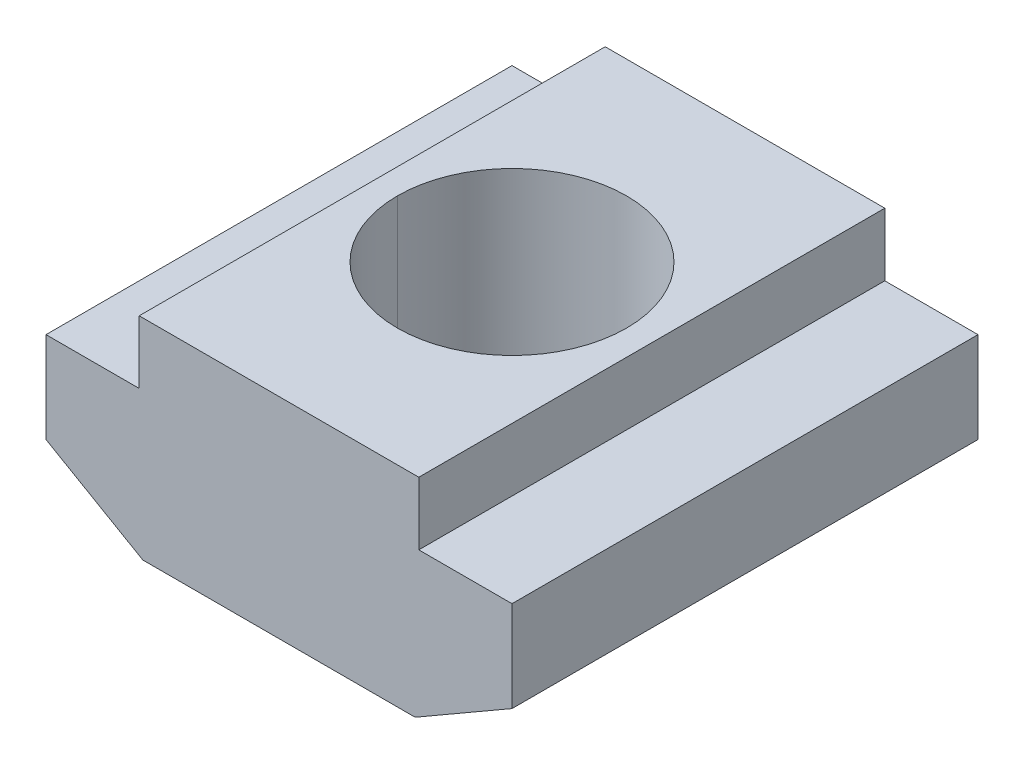
ISO-10303-21;
HEADER;
FILE_DESCRIPTION(('STEP AP214'),'2;1');
FILE_NAME('part.step','',(''),(''),'','','');
FILE_SCHEMA(('AUTOMOTIVE_DESIGN { 1 0 10303 214 1 1 1 1 }'));
ENDSEC;
DATA;
#1=APPLICATION_CONTEXT('core data for automotive mechanical design processes');
#2=APPLICATION_PROTOCOL_DEFINITION('international standard','automotive_design',2000,#1);
#3=PRODUCT_CONTEXT('',#1,'mechanical');
#4=PRODUCT('Part','Part','',(#3));
#5=PRODUCT_RELATED_PRODUCT_CATEGORY('part','',(#4));
#6=PRODUCT_DEFINITION_FORMATION('','',#4);
#7=PRODUCT_DEFINITION_CONTEXT('part definition',#1,'design');
#8=PRODUCT_DEFINITION('design','',#6,#7);
#9=PRODUCT_DEFINITION_SHAPE('','',#8);
#10=(LENGTH_UNIT() NAMED_UNIT(*) SI_UNIT(.MILLI.,.METRE.));
#11=(NAMED_UNIT(*) PLANE_ANGLE_UNIT() SI_UNIT($,.RADIAN.));
#12=(NAMED_UNIT(*) SI_UNIT($,.STERADIAN.) SOLID_ANGLE_UNIT());
#13=UNCERTAINTY_MEASURE_WITH_UNIT(LENGTH_MEASURE(1.E-05),#10,'distance_accuracy_value','');
#14=(GEOMETRIC_REPRESENTATION_CONTEXT(3) GLOBAL_UNCERTAINTY_ASSIGNED_CONTEXT((#13)) GLOBAL_UNIT_ASSIGNED_CONTEXT((#10,
#11,#12)) REPRESENTATION_CONTEXT('',''));
#15=CARTESIAN_POINT('',(0.,0.,0.));
#16=DIRECTION('',(0.,0.,1.));
#17=DIRECTION('',(1.,0.,0.));
#18=AXIS2_PLACEMENT_3D('',#15,#16,#17);
#19=CARTESIAN_POINT('',(-5.,-0.375,0.));
#20=DIRECTION('',(0.50000000000019,0.866025403784329,0.));
#21=DIRECTION('',(0.,0.,-1.));
#22=AXIS2_PLACEMENT_3D('',#19,#20,#21);
#23=PLANE('',#22);
#24=DIRECTION('',(0.,0.,1.));
#25=VECTOR('',#24,1.);
#26=CARTESIAN_POINT('',(-5.,-0.375,0.));
#27=LINE('',#26,#25);
#28=CARTESIAN_POINT('',(-5.,-0.375,-5.));
#29=VERTEX_POINT('',#28);
#30=CARTESIAN_POINT('',(-5.,-0.375,5.));
#31=VERTEX_POINT('',#30);
#32=EDGE_CURVE('E218',#29,#31,#27,.T.);
#33=ORIENTED_EDGE('',*,*,#32,.F.);
#34=DIRECTION('',(0.866025403784329,-0.50000000000019,0.));
#35=VECTOR('',#34,1.);
#36=CARTESIAN_POINT('',(-3.96076951546,-0.975,-5.));
#37=LINE('',#36,#35);
#38=CARTESIAN_POINT('',(-2.92153903092,-1.575,-5.));
#39=VERTEX_POINT('',#38);
#40=EDGE_CURVE('E196',#29,#39,#37,.T.);
#41=ORIENTED_EDGE('',*,*,#40,.T.);
#42=DIRECTION('',(0.,0.,1.));
#43=VECTOR('',#42,1.);
#44=CARTESIAN_POINT('',(-2.92153903092,-1.575,0.));
#45=LINE('',#44,#43);
#46=CARTESIAN_POINT('',(-2.92153903092,-1.575,5.));
#47=VERTEX_POINT('',#46);
#48=EDGE_CURVE('E11',#39,#47,#45,.T.);
#49=ORIENTED_EDGE('',*,*,#48,.T.);
#50=DIRECTION('',(-0.866025403784329,0.50000000000019,0.));
#51=VECTOR('',#50,1.);
#52=CARTESIAN_POINT('',(-3.96076951546,-0.975,5.));
#53=LINE('',#52,#51);
#54=EDGE_CURVE('E25',#47,#31,#53,.T.);
#55=ORIENTED_EDGE('',*,*,#54,.T.);
#56=EDGE_LOOP('',(#33,#41,#49,#55));
#57=FACE_BOUND('',#56,.T.);
#58=ADVANCED_FACE('F17',(#57),#23,.F.);
#59=CARTESIAN_POINT('',(5.,-1.575,0.));
#60=DIRECTION('',(0.,1.,0.));
#61=DIRECTION('',(1.,0.,0.));
#62=AXIS2_PLACEMENT_3D('',#59,#60,#61);
#63=PLANE('',#62);
#64=CARTESIAN_POINT('',(0.,-1.575,0.));
#65=DIRECTION('',(0.,1.,0.));
#66=DIRECTION('',(1.,0.,0.));
#67=AXIS2_PLACEMENT_3D('',#64,#65,#66);
#68=CIRCLE('',#67,2.4585);
#69=CARTESIAN_POINT('',(-2.4585,-1.575,0.));
#70=VERTEX_POINT('',#69);
#71=CARTESIAN_POINT('',(2.4585,-1.575,0.));
#72=VERTEX_POINT('',#71);
#73=EDGE_CURVE('E287',#70,#72,#68,.T.);
#74=ORIENTED_EDGE('',*,*,#73,.T.);
#75=CARTESIAN_POINT('',(0.,-1.575,0.));
#76=DIRECTION('',(0.,1.,0.));
#77=DIRECTION('',(1.,0.,0.));
#78=AXIS2_PLACEMENT_3D('',#75,#76,#77);
#79=CIRCLE('',#78,2.4585);
#80=EDGE_CURVE('E243',#72,#70,#79,.T.);
#81=ORIENTED_EDGE('',*,*,#80,.T.);
#82=EDGE_LOOP('',(#74,#81));
#83=FACE_BOUND('',#82,.T.);
#84=ORIENTED_EDGE('',*,*,#48,.F.);
#85=DIRECTION('',(1.,0.,0.));
#86=VECTOR('',#85,1.);
#87=CARTESIAN_POINT('',(0.,-1.575,-5.));
#88=LINE('',#87,#86);
#89=CARTESIAN_POINT('',(2.92153903092,-1.575,-5.));
#90=VERTEX_POINT('',#89);
#91=EDGE_CURVE('E192',#39,#90,#88,.T.);
#92=ORIENTED_EDGE('',*,*,#91,.T.);
#93=DIRECTION('',(0.,0.,1.));
#94=VECTOR('',#93,1.);
#95=CARTESIAN_POINT('',(2.92153903092,-1.575,0.));
#96=LINE('',#95,#94);
#97=CARTESIAN_POINT('',(2.92153903092,-1.575,5.));
#98=VERTEX_POINT('',#97);
#99=EDGE_CURVE('E180',#90,#98,#96,.T.);
#100=ORIENTED_EDGE('',*,*,#99,.T.);
#101=DIRECTION('',(1.,0.,0.));
#102=VECTOR('',#101,1.);
#103=CARTESIAN_POINT('',(0.,-1.575,5.));
#104=LINE('',#103,#102);
#105=EDGE_CURVE('E195',#47,#98,#104,.T.);
#106=ORIENTED_EDGE('',*,*,#105,.F.);
#107=EDGE_LOOP('',(#84,#92,#100,#106));
#108=FACE_BOUND('',#107,.T.);
#109=ADVANCED_FACE('F306',(#83,#108),#63,.F.);
#110=CARTESIAN_POINT('',(0.,0.,5.));
#111=DIRECTION('',(0.,0.,1.));
#112=DIRECTION('',(1.,0.,0.));
#113=AXIS2_PLACEMENT_3D('',#110,#111,#112);
#114=PLANE('',#113);
#115=ORIENTED_EDGE('',*,*,#105,.T.);
#116=DIRECTION('',(-0.866025403784329,-0.50000000000019,0.));
#117=VECTOR('',#116,1.);
#118=CARTESIAN_POINT('',(3.96076951546,-0.975,5.));
#119=LINE('',#118,#117);
#120=CARTESIAN_POINT('',(5.,-0.375,5.));
#121=VERTEX_POINT('',#120);
#122=EDGE_CURVE('E179',#121,#98,#119,.T.);
#123=ORIENTED_EDGE('',*,*,#122,.F.);
#124=DIRECTION('',(0.,1.,0.));
#125=VECTOR('',#124,1.);
#126=CARTESIAN_POINT('',(5.,0.6,5.));
#127=LINE('',#126,#125);
#128=CARTESIAN_POINT('',(5.,1.575,5.));
#129=VERTEX_POINT('',#128);
#130=EDGE_CURVE('E212',#121,#129,#127,.T.);
#131=ORIENTED_EDGE('',*,*,#130,.T.);
#132=DIRECTION('',(-1.,0.,0.));
#133=VECTOR('',#132,1.);
#134=CARTESIAN_POINT('',(4.,1.575,5.));
#135=LINE('',#134,#133);
#136=CARTESIAN_POINT('',(3.,1.575,5.));
#137=VERTEX_POINT('',#136);
#138=EDGE_CURVE('E164',#129,#137,#135,.T.);
#139=ORIENTED_EDGE('',*,*,#138,.T.);
#140=DIRECTION('',(0.,1.,0.));
#141=VECTOR('',#140,1.);
#142=CARTESIAN_POINT('',(3.,2.25,5.));
#143=LINE('',#142,#141);
#144=CARTESIAN_POINT('',(3.,2.925,5.));
#145=VERTEX_POINT('',#144);
#146=EDGE_CURVE('E191',#137,#145,#143,.T.);
#147=ORIENTED_EDGE('',*,*,#146,.T.);
#148=DIRECTION('',(-1.,0.,0.));
#149=VECTOR('',#148,1.);
#150=CARTESIAN_POINT('',(0.,2.925,5.));
#151=LINE('',#150,#149);
#152=CARTESIAN_POINT('',(-3.,2.925,5.));
#153=VERTEX_POINT('',#152);
#154=EDGE_CURVE('E140',#145,#153,#151,.T.);
#155=ORIENTED_EDGE('',*,*,#154,.T.);
#156=DIRECTION('',(0.,-1.,0.));
#157=VECTOR('',#156,1.);
#158=CARTESIAN_POINT('',(-3.,2.25,5.));
#159=LINE('',#158,#157);
#160=CARTESIAN_POINT('',(-3.,1.575,5.));
#161=VERTEX_POINT('',#160);
#162=EDGE_CURVE('E133',#153,#161,#159,.T.);
#163=ORIENTED_EDGE('',*,*,#162,.T.);
#164=DIRECTION('',(-1.,0.,0.));
#165=VECTOR('',#164,1.);
#166=CARTESIAN_POINT('',(-4.,1.575,5.));
#167=LINE('',#166,#165);
#168=CARTESIAN_POINT('',(-5.,1.575,5.));
#169=VERTEX_POINT('',#168);
#170=EDGE_CURVE('E137',#161,#169,#167,.T.);
#171=ORIENTED_EDGE('',*,*,#170,.T.);
#172=DIRECTION('',(0.,-1.,0.));
#173=VECTOR('',#172,1.);
#174=CARTESIAN_POINT('',(-5.,0.6,5.));
#175=LINE('',#174,#173);
#176=EDGE_CURVE('E222',#169,#31,#175,.T.);
#177=ORIENTED_EDGE('',*,*,#176,.T.);
#178=ORIENTED_EDGE('',*,*,#54,.F.);
#179=EDGE_LOOP('',(#115,#123,#131,#139,#147,#155,#163,#171,#177,#178));
#180=FACE_BOUND('',#179,.T.);
#181=ADVANCED_FACE('F135',(#180),#114,.T.);
#182=CARTESIAN_POINT('',(0.,0.,-5.));
#183=DIRECTION('',(0.,0.,1.));
#184=DIRECTION('',(1.,0.,0.));
#185=AXIS2_PLACEMENT_3D('',#182,#183,#184);
#186=PLANE('',#185);
#187=ORIENTED_EDGE('',*,*,#40,.F.);
#188=DIRECTION('',(0.,-1.,0.));
#189=VECTOR('',#188,1.);
#190=CARTESIAN_POINT('',(-5.,0.6,-5.));
#191=LINE('',#190,#189);
#192=CARTESIAN_POINT('',(-5.,1.575,-5.));
#193=VERTEX_POINT('',#192);
#194=EDGE_CURVE('E225',#193,#29,#191,.T.);
#195=ORIENTED_EDGE('',*,*,#194,.F.);
#196=DIRECTION('',(-1.,0.,0.));
#197=VECTOR('',#196,1.);
#198=CARTESIAN_POINT('',(-4.,1.575,-5.));
#199=LINE('',#198,#197);
#200=CARTESIAN_POINT('',(-3.,1.575,-5.));
#201=VERTEX_POINT('',#200);
#202=EDGE_CURVE('E163',#201,#193,#199,.T.);
#203=ORIENTED_EDGE('',*,*,#202,.F.);
#204=DIRECTION('',(0.,-1.,0.));
#205=VECTOR('',#204,1.);
#206=CARTESIAN_POINT('',(-3.,2.25,-5.));
#207=LINE('',#206,#205);
#208=CARTESIAN_POINT('',(-3.,2.925,-5.));
#209=VERTEX_POINT('',#208);
#210=EDGE_CURVE('E147',#209,#201,#207,.T.);
#211=ORIENTED_EDGE('',*,*,#210,.F.);
#212=DIRECTION('',(-1.,0.,0.));
#213=VECTOR('',#212,1.);
#214=CARTESIAN_POINT('',(0.,2.925,-5.));
#215=LINE('',#214,#213);
#216=CARTESIAN_POINT('',(3.,2.925,-5.));
#217=VERTEX_POINT('',#216);
#218=EDGE_CURVE('E199',#217,#209,#215,.T.);
#219=ORIENTED_EDGE('',*,*,#218,.F.);
#220=DIRECTION('',(0.,1.,0.));
#221=VECTOR('',#220,1.);
#222=CARTESIAN_POINT('',(3.,2.25,-5.));
#223=LINE('',#222,#221);
#224=CARTESIAN_POINT('',(3.,1.575,-5.));
#225=VERTEX_POINT('',#224);
#226=EDGE_CURVE('E146',#225,#217,#223,.T.);
#227=ORIENTED_EDGE('',*,*,#226,.F.);
#228=DIRECTION('',(-1.,0.,0.));
#229=VECTOR('',#228,1.);
#230=CARTESIAN_POINT('',(4.,1.575,-5.));
#231=LINE('',#230,#229);
#232=CARTESIAN_POINT('',(5.,1.575,-5.));
#233=VERTEX_POINT('',#232);
#234=EDGE_CURVE('E252',#233,#225,#231,.T.);
#235=ORIENTED_EDGE('',*,*,#234,.F.);
#236=DIRECTION('',(0.,1.,0.));
#237=VECTOR('',#236,1.);
#238=CARTESIAN_POINT('',(5.,0.6,-5.));
#239=LINE('',#238,#237);
#240=CARTESIAN_POINT('',(5.,-0.375,-5.));
#241=VERTEX_POINT('',#240);
#242=EDGE_CURVE('E208',#241,#233,#239,.T.);
#243=ORIENTED_EDGE('',*,*,#242,.F.);
#244=DIRECTION('',(0.866025403784329,0.50000000000019,0.));
#245=VECTOR('',#244,1.);
#246=CARTESIAN_POINT('',(3.96076951546,-0.975,-5.));
#247=LINE('',#246,#245);
#248=EDGE_CURVE('E177',#90,#241,#247,.T.);
#249=ORIENTED_EDGE('',*,*,#248,.F.);
#250=ORIENTED_EDGE('',*,*,#91,.F.);
#251=EDGE_LOOP('',(#187,#195,#203,#211,#219,#227,#235,#243,#249,#250));
#252=FACE_BOUND('',#251,.T.);
#253=ADVANCED_FACE('F277',(#252),#186,.F.);
#254=CARTESIAN_POINT('',(-5.,-1.575,0.));
#255=DIRECTION('',(1.,0.,0.));
#256=DIRECTION('',(0.,1.,0.));
#257=AXIS2_PLACEMENT_3D('',#254,#255,#256);
#258=PLANE('',#257);
#259=ORIENTED_EDGE('',*,*,#32,.T.);
#260=ORIENTED_EDGE('',*,*,#176,.F.);
#261=DIRECTION('',(0.,0.,1.));
#262=VECTOR('',#261,1.);
#263=CARTESIAN_POINT('',(-5.,1.575,0.));
#264=LINE('',#263,#262);
#265=EDGE_CURVE('E155',#193,#169,#264,.T.);
#266=ORIENTED_EDGE('',*,*,#265,.F.);
#267=ORIENTED_EDGE('',*,*,#194,.T.);
#268=EDGE_LOOP('',(#259,#260,#266,#267));
#269=FACE_BOUND('',#268,.T.);
#270=ADVANCED_FACE('F234',(#269),#258,.F.);
#271=CARTESIAN_POINT('',(5.,-0.375,0.));
#272=DIRECTION('',(-0.50000000000019,0.866025403784329,0.));
#273=DIRECTION('',(0.,0.,1.));
#274=AXIS2_PLACEMENT_3D('',#271,#272,#273);
#275=PLANE('',#274);
#276=ORIENTED_EDGE('',*,*,#99,.F.);
#277=ORIENTED_EDGE('',*,*,#248,.T.);
#278=DIRECTION('',(0.,0.,1.));
#279=VECTOR('',#278,1.);
#280=CARTESIAN_POINT('',(5.,-0.375,0.));
#281=LINE('',#280,#279);
#282=EDGE_CURVE('E204',#241,#121,#281,.T.);
#283=ORIENTED_EDGE('',*,*,#282,.T.);
#284=ORIENTED_EDGE('',*,*,#122,.T.);
#285=EDGE_LOOP('',(#276,#277,#283,#284));
#286=FACE_BOUND('',#285,.T.);
#287=ADVANCED_FACE('F274',(#286),#275,.F.);
#288=CARTESIAN_POINT('',(5.,1.575,0.));
#289=DIRECTION('',(-1.,0.,0.));
#290=DIRECTION('',(0.,0.,1.));
#291=AXIS2_PLACEMENT_3D('',#288,#289,#290);
#292=PLANE('',#291);
#293=ORIENTED_EDGE('',*,*,#282,.F.);
#294=ORIENTED_EDGE('',*,*,#242,.T.);
#295=DIRECTION('',(0.,0.,1.));
#296=VECTOR('',#295,1.);
#297=CARTESIAN_POINT('',(5.,1.575,0.));
#298=LINE('',#297,#296);
#299=EDGE_CURVE('E246',#233,#129,#298,.T.);
#300=ORIENTED_EDGE('',*,*,#299,.T.);
#301=ORIENTED_EDGE('',*,*,#130,.F.);
#302=EDGE_LOOP('',(#293,#294,#300,#301));
#303=FACE_BOUND('',#302,.T.);
#304=ADVANCED_FACE('F271',(#303),#292,.F.);
#305=CARTESIAN_POINT('',(-3.,2.925,0.));
#306=DIRECTION('',(0.,-1.,0.));
#307=DIRECTION('',(0.,0.,-1.));
#308=AXIS2_PLACEMENT_3D('',#305,#306,#307);
#309=PLANE('',#308);
#310=CARTESIAN_POINT('',(0.,2.925,0.));
#311=DIRECTION('',(0.,-1.,0.));
#312=DIRECTION('',(1.,0.,0.));
#313=AXIS2_PLACEMENT_3D('',#310,#311,#312);
#314=CIRCLE('',#313,2.4585);
#315=CARTESIAN_POINT('',(2.4585,2.925,0.));
#316=VERTEX_POINT('',#315);
#317=CARTESIAN_POINT('',(-2.4585,2.925,0.));
#318=VERTEX_POINT('',#317);
#319=EDGE_CURVE('E281',#316,#318,#314,.T.);
#320=ORIENTED_EDGE('',*,*,#319,.T.);
#321=CARTESIAN_POINT('',(0.,2.925,0.));
#322=DIRECTION('',(0.,-1.,0.));
#323=DIRECTION('',(1.,0.,0.));
#324=AXIS2_PLACEMENT_3D('',#321,#322,#323);
#325=CIRCLE('',#324,2.4585);
#326=EDGE_CURVE('E241',#318,#316,#325,.T.);
#327=ORIENTED_EDGE('',*,*,#326,.T.);
#328=EDGE_LOOP('',(#320,#327));
#329=FACE_BOUND('',#328,.T.);
#330=DIRECTION('',(0.,0.,1.));
#331=VECTOR('',#330,1.);
#332=CARTESIAN_POINT('',(3.,2.925,0.));
#333=LINE('',#332,#331);
#334=EDGE_CURVE('E187',#217,#145,#333,.T.);
#335=ORIENTED_EDGE('',*,*,#334,.F.);
#336=ORIENTED_EDGE('',*,*,#218,.T.);
#337=DIRECTION('',(0.,0.,1.));
#338=VECTOR('',#337,1.);
#339=CARTESIAN_POINT('',(-3.,2.925,0.));
#340=LINE('',#339,#338);
#341=EDGE_CURVE('E157',#209,#153,#340,.T.);
#342=ORIENTED_EDGE('',*,*,#341,.T.);
#343=ORIENTED_EDGE('',*,*,#154,.F.);
#344=EDGE_LOOP('',(#335,#336,#342,#343));
#345=FACE_BOUND('',#344,.T.);
#346=ADVANCED_FACE('F332',(#329,#345),#309,.F.);
#347=CARTESIAN_POINT('',(3.,2.925,0.));
#348=DIRECTION('',(-1.,0.,0.));
#349=DIRECTION('',(0.,0.,1.));
#350=AXIS2_PLACEMENT_3D('',#347,#348,#349);
#351=PLANE('',#350);
#352=DIRECTION('',(0.,0.,1.));
#353=VECTOR('',#352,1.);
#354=CARTESIAN_POINT('',(3.,1.575,0.));
#355=LINE('',#354,#353);
#356=EDGE_CURVE('E172',#225,#137,#355,.T.);
#357=ORIENTED_EDGE('',*,*,#356,.F.);
#358=ORIENTED_EDGE('',*,*,#226,.T.);
#359=ORIENTED_EDGE('',*,*,#334,.T.);
#360=ORIENTED_EDGE('',*,*,#146,.F.);
#361=EDGE_LOOP('',(#357,#358,#359,#360));
#362=FACE_BOUND('',#361,.T.);
#363=ADVANCED_FACE('F266',(#362),#351,.F.);
#364=CARTESIAN_POINT('',(-3.,1.575,0.));
#365=DIRECTION('',(1.,0.,0.));
#366=DIRECTION('',(0.,1.,0.));
#367=AXIS2_PLACEMENT_3D('',#364,#365,#366);
#368=PLANE('',#367);
#369=ORIENTED_EDGE('',*,*,#341,.F.);
#370=ORIENTED_EDGE('',*,*,#210,.T.);
#371=DIRECTION('',(0.,0.,1.));
#372=VECTOR('',#371,1.);
#373=CARTESIAN_POINT('',(-3.,1.575,0.));
#374=LINE('',#373,#372);
#375=EDGE_CURVE('E153',#201,#161,#374,.T.);
#376=ORIENTED_EDGE('',*,*,#375,.T.);
#377=ORIENTED_EDGE('',*,*,#162,.F.);
#378=EDGE_LOOP('',(#369,#370,#376,#377));
#379=FACE_BOUND('',#378,.T.);
#380=ADVANCED_FACE('F159',(#379),#368,.F.);
#381=CARTESIAN_POINT('',(3.,1.575,0.));
#382=DIRECTION('',(0.,-1.,0.));
#383=DIRECTION('',(0.,0.,-1.));
#384=AXIS2_PLACEMENT_3D('',#381,#382,#383);
#385=PLANE('',#384);
#386=ORIENTED_EDGE('',*,*,#375,.F.);
#387=ORIENTED_EDGE('',*,*,#202,.T.);
#388=ORIENTED_EDGE('',*,*,#265,.T.);
#389=ORIENTED_EDGE('',*,*,#170,.F.);
#390=EDGE_LOOP('',(#386,#387,#388,#389));
#391=FACE_BOUND('',#390,.T.);
#392=ADVANCED_FACE('F151',(#391),#385,.F.);
#393=CARTESIAN_POINT('',(3.,1.575,0.));
#394=DIRECTION('',(0.,-1.,0.));
#395=DIRECTION('',(0.,0.,-1.));
#396=AXIS2_PLACEMENT_3D('',#393,#394,#395);
#397=PLANE('',#396);
#398=ORIENTED_EDGE('',*,*,#299,.F.);
#399=ORIENTED_EDGE('',*,*,#234,.T.);
#400=ORIENTED_EDGE('',*,*,#356,.T.);
#401=ORIENTED_EDGE('',*,*,#138,.F.);
#402=EDGE_LOOP('',(#398,#399,#400,#401));
#403=FACE_BOUND('',#402,.T.);
#404=ADVANCED_FACE('F263',(#403),#397,.F.);
#405=CARTESIAN_POINT('',(0.,-1.575,0.));
#406=DIRECTION('',(0.,1.,0.));
#407=DIRECTION('',(1.,0.,0.));
#408=AXIS2_PLACEMENT_3D('',#405,#406,#407);
#409=CYLINDRICAL_SURFACE('',#408,2.4585);
#410=DIRECTION('',(0.,-1.,0.));
#411=VECTOR('',#410,1.);
#412=CARTESIAN_POINT('',(2.4585,3.26999999998,0.));
#413=LINE('',#412,#411);
#414=EDGE_CURVE('E285',#316,#72,#413,.T.);
#415=ORIENTED_EDGE('',*,*,#414,.F.);
#416=ORIENTED_EDGE('',*,*,#326,.F.);
#417=DIRECTION('',(0.,-1.,0.));
#418=VECTOR('',#417,1.);
#419=CARTESIAN_POINT('',(-2.4585,3.26999999998,0.));
#420=LINE('',#419,#418);
#421=EDGE_CURVE('E286',#318,#70,#420,.T.);
#422=ORIENTED_EDGE('',*,*,#421,.T.);
#423=ORIENTED_EDGE('',*,*,#80,.F.);
#424=EDGE_LOOP('',(#415,#416,#422,#423));
#425=FACE_BOUND('',#424,.T.);
#426=ADVANCED_FACE('F300',(#425),#409,.F.);
#427=CARTESIAN_POINT('',(0.,-1.575,0.));
#428=DIRECTION('',(0.,1.,0.));
#429=DIRECTION('',(1.,0.,0.));
#430=AXIS2_PLACEMENT_3D('',#427,#428,#429);
#431=CYLINDRICAL_SURFACE('',#430,2.4585);
#432=ORIENTED_EDGE('',*,*,#421,.F.);
#433=ORIENTED_EDGE('',*,*,#319,.F.);
#434=ORIENTED_EDGE('',*,*,#414,.T.);
#435=ORIENTED_EDGE('',*,*,#73,.F.);
#436=EDGE_LOOP('',(#432,#433,#434,#435));
#437=FACE_BOUND('',#436,.T.);
#438=ADVANCED_FACE('F304',(#437),#431,.F.);
#439=CLOSED_SHELL('',(#58,#109,#181,#253,#270,#287,#304,#346,#363,#380,#392,#404,#426,#438));
#440=MANIFOLD_SOLID_BREP('B1',#439);
#441=ADVANCED_BREP_SHAPE_REPRESENTATION('',(#18,#440),#14);
#442=SHAPE_DEFINITION_REPRESENTATION(#9,#441);
ENDSEC;
END-ISO-10303-21;
